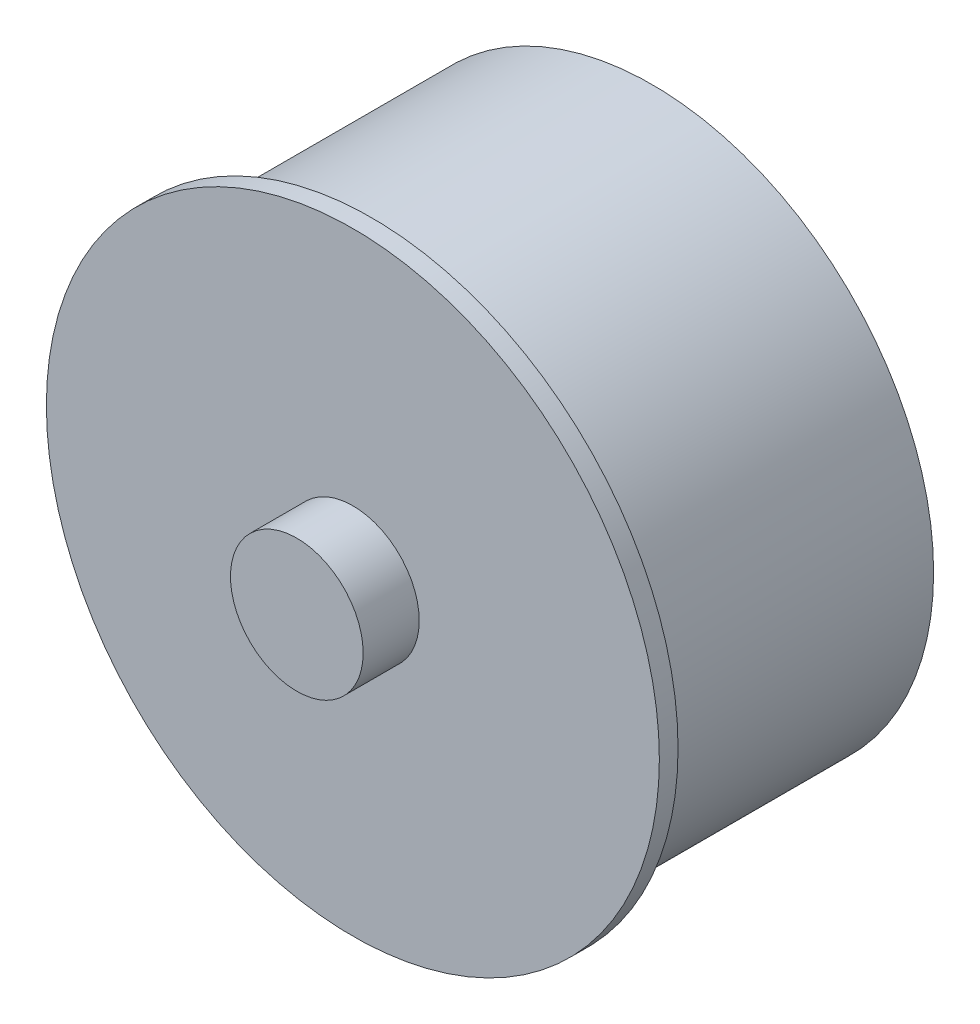
ISO-10303-21;
HEADER;
FILE_DESCRIPTION(('STEP AP214'),'2;1');
FILE_NAME('part.step','',(''),(''),'','','');
FILE_SCHEMA(('AUTOMOTIVE_DESIGN { 1 0 10303 214 1 1 1 1 }'));
ENDSEC;
DATA;
#1=APPLICATION_CONTEXT('core data for automotive mechanical design processes');
#2=APPLICATION_PROTOCOL_DEFINITION('international standard','automotive_design',2000,#1);
#3=PRODUCT_CONTEXT('',#1,'mechanical');
#4=PRODUCT('Part','Part','',(#3));
#5=PRODUCT_RELATED_PRODUCT_CATEGORY('part','',(#4));
#6=PRODUCT_DEFINITION_FORMATION('','',#4);
#7=PRODUCT_DEFINITION_CONTEXT('part definition',#1,'design');
#8=PRODUCT_DEFINITION('design','',#6,#7);
#9=PRODUCT_DEFINITION_SHAPE('','',#8);
#10=(LENGTH_UNIT() NAMED_UNIT(*) SI_UNIT(.MILLI.,.METRE.));
#11=(NAMED_UNIT(*) PLANE_ANGLE_UNIT() SI_UNIT($,.RADIAN.));
#12=(NAMED_UNIT(*) SI_UNIT($,.STERADIAN.) SOLID_ANGLE_UNIT());
#13=UNCERTAINTY_MEASURE_WITH_UNIT(LENGTH_MEASURE(1.E-05),#10,'distance_accuracy_value','');
#14=(GEOMETRIC_REPRESENTATION_CONTEXT(3) GLOBAL_UNCERTAINTY_ASSIGNED_CONTEXT((#13)) GLOBAL_UNIT_ASSIGNED_CONTEXT((#10,
#11,#12)) REPRESENTATION_CONTEXT('',''));
#15=CARTESIAN_POINT('',(0.,0.,0.));
#16=DIRECTION('',(0.,0.,1.));
#17=DIRECTION('',(1.,0.,0.));
#18=AXIS2_PLACEMENT_3D('',#15,#16,#17);
#19=CARTESIAN_POINT('',(0.,0.,-2.));
#20=DIRECTION('',(0.,0.,1.));
#21=DIRECTION('',(1.,0.,0.));
#22=AXIS2_PLACEMENT_3D('',#19,#20,#21);
#23=CYLINDRICAL_SURFACE('',#22,10.075);
#24=CARTESIAN_POINT('',(0.,0.,0.));
#25=DIRECTION('',(0.,0.,-1.));
#26=DIRECTION('',(-1.,0.,0.));
#27=AXIS2_PLACEMENT_3D('',#24,#25,#26);
#28=CIRCLE('',#27,10.075);
#29=CARTESIAN_POINT('',(-10.075,0.,0.));
#30=VERTEX_POINT('',#29);
#31=EDGE_CURVE('E11',#30,#30,#28,.T.);
#32=ORIENTED_EDGE('',*,*,#31,.T.);
#33=EDGE_LOOP('',(#32));
#34=FACE_BOUND('',#33,.T.);
#35=CARTESIAN_POINT('',(0.,0.,-1.));
#36=DIRECTION('',(0.,0.,-1.));
#37=DIRECTION('',(-1.,0.,0.));
#38=AXIS2_PLACEMENT_3D('',#35,#36,#37);
#39=CIRCLE('',#38,10.075);
#40=CARTESIAN_POINT('',(-10.075,0.,-1.));
#41=VERTEX_POINT('',#40);
#42=EDGE_CURVE('E87',#41,#41,#39,.T.);
#43=ORIENTED_EDGE('',*,*,#42,.F.);
#44=EDGE_LOOP('',(#43));
#45=FACE_BOUND('',#44,.T.);
#46=ADVANCED_FACE('F44',(#34,#45),#23,.T.);
#47=CARTESIAN_POINT('',(8.,0.,8.));
#48=DIRECTION('',(0.,0.,-1.));
#49=DIRECTION('',(-1.,0.,0.));
#50=AXIS2_PLACEMENT_3D('',#47,#48,#49);
#51=CYLINDRICAL_SURFACE('',#50,1.05);
#52=CARTESIAN_POINT('',(8.,0.,0.));
#53=DIRECTION('',(0.,0.,-1.));
#54=DIRECTION('',(-1.,0.,0.));
#55=AXIS2_PLACEMENT_3D('',#52,#53,#54);
#56=CIRCLE('',#55,1.05);
#57=CARTESIAN_POINT('',(6.95,0.,0.));
#58=VERTEX_POINT('',#57);
#59=EDGE_CURVE('E61',#58,#58,#56,.T.);
#60=ORIENTED_EDGE('',*,*,#59,.F.);
#61=EDGE_LOOP('',(#60));
#62=FACE_BOUND('',#61,.T.);
#63=CARTESIAN_POINT('',(8.,0.,-1.));
#64=DIRECTION('',(0.,0.,-1.));
#65=DIRECTION('',(-1.,0.,0.));
#66=AXIS2_PLACEMENT_3D('',#63,#64,#65);
#67=CIRCLE('',#66,1.05);
#68=CARTESIAN_POINT('',(6.95,0.,-1.));
#69=VERTEX_POINT('',#68);
#70=EDGE_CURVE('E59',#69,#69,#67,.F.);
#71=ORIENTED_EDGE('',*,*,#70,.F.);
#72=EDGE_LOOP('',(#71));
#73=FACE_BOUND('',#72,.T.);
#74=ADVANCED_FACE('F96',(#62,#73),#51,.F.);
#75=CARTESIAN_POINT('',(0.,-8.,8.));
#76=DIRECTION('',(0.,0.,-1.));
#77=DIRECTION('',(-1.,0.,0.));
#78=AXIS2_PLACEMENT_3D('',#75,#76,#77);
#79=CYLINDRICAL_SURFACE('',#78,1.05);
#80=CARTESIAN_POINT('',(0.,-8.,0.));
#81=DIRECTION('',(0.,0.,-1.));
#82=DIRECTION('',(-1.,0.,0.));
#83=AXIS2_PLACEMENT_3D('',#80,#81,#82);
#84=CIRCLE('',#83,1.05);
#85=CARTESIAN_POINT('',(-1.04999999999994,-8.,0.));
#86=VERTEX_POINT('',#85);
#87=EDGE_CURVE('E64',#86,#86,#84,.T.);
#88=ORIENTED_EDGE('',*,*,#87,.F.);
#89=EDGE_LOOP('',(#88));
#90=FACE_BOUND('',#89,.T.);
#91=CARTESIAN_POINT('',(0.,-8.,-1.));
#92=DIRECTION('',(0.,0.,-1.));
#93=DIRECTION('',(-1.,0.,0.));
#94=AXIS2_PLACEMENT_3D('',#91,#92,#93);
#95=CIRCLE('',#94,1.05);
#96=CARTESIAN_POINT('',(-1.04999999999994,-8.,-1.));
#97=VERTEX_POINT('',#96);
#98=EDGE_CURVE('E83',#97,#97,#95,.F.);
#99=ORIENTED_EDGE('',*,*,#98,.F.);
#100=EDGE_LOOP('',(#99));
#101=FACE_BOUND('',#100,.T.);
#102=ADVANCED_FACE('F77',(#90,#101),#79,.F.);
#103=CARTESIAN_POINT('',(-8.,0.,8.));
#104=DIRECTION('',(0.,0.,-1.));
#105=DIRECTION('',(-1.,0.,0.));
#106=AXIS2_PLACEMENT_3D('',#103,#104,#105);
#107=CYLINDRICAL_SURFACE('',#106,1.05);
#108=CARTESIAN_POINT('',(-8.,0.,0.));
#109=DIRECTION('',(0.,0.,-1.));
#110=DIRECTION('',(-1.,0.,0.));
#111=AXIS2_PLACEMENT_3D('',#108,#109,#110);
#112=CIRCLE('',#111,1.05);
#113=CARTESIAN_POINT('',(-9.05,0.,0.));
#114=VERTEX_POINT('',#113);
#115=EDGE_CURVE('E56',#114,#114,#112,.T.);
#116=ORIENTED_EDGE('',*,*,#115,.F.);
#117=EDGE_LOOP('',(#116));
#118=FACE_BOUND('',#117,.T.);
#119=CARTESIAN_POINT('',(-8.,0.,-1.));
#120=DIRECTION('',(0.,0.,-1.));
#121=DIRECTION('',(-1.,0.,0.));
#122=AXIS2_PLACEMENT_3D('',#119,#120,#121);
#123=CIRCLE('',#122,1.05);
#124=CARTESIAN_POINT('',(-9.05,0.,-1.));
#125=VERTEX_POINT('',#124);
#126=EDGE_CURVE('E81',#125,#125,#123,.F.);
#127=ORIENTED_EDGE('',*,*,#126,.F.);
#128=EDGE_LOOP('',(#127));
#129=FACE_BOUND('',#128,.T.);
#130=ADVANCED_FACE('F73',(#118,#129),#107,.F.);
#131=CARTESIAN_POINT('',(0.,8.,8.));
#132=DIRECTION('',(0.,0.,-1.));
#133=DIRECTION('',(-1.,0.,0.));
#134=AXIS2_PLACEMENT_3D('',#131,#132,#133);
#135=CYLINDRICAL_SURFACE('',#134,1.05);
#136=CARTESIAN_POINT('',(0.,8.,0.));
#137=DIRECTION('',(0.,0.,-1.));
#138=DIRECTION('',(-1.,0.,0.));
#139=AXIS2_PLACEMENT_3D('',#136,#137,#138);
#140=CIRCLE('',#139,1.05);
#141=CARTESIAN_POINT('',(-1.05,8.,0.));
#142=VERTEX_POINT('',#141);
#143=EDGE_CURVE('E51',#142,#142,#140,.T.);
#144=ORIENTED_EDGE('',*,*,#143,.F.);
#145=EDGE_LOOP('',(#144));
#146=FACE_BOUND('',#145,.T.);
#147=CARTESIAN_POINT('',(0.,8.,-1.));
#148=DIRECTION('',(0.,0.,-1.));
#149=DIRECTION('',(-1.,0.,0.));
#150=AXIS2_PLACEMENT_3D('',#147,#148,#149);
#151=CIRCLE('',#150,1.05);
#152=CARTESIAN_POINT('',(-1.05,8.,-1.));
#153=VERTEX_POINT('',#152);
#154=EDGE_CURVE('E47',#153,#153,#151,.F.);
#155=ORIENTED_EDGE('',*,*,#154,.F.);
#156=EDGE_LOOP('',(#155));
#157=FACE_BOUND('',#156,.T.);
#158=ADVANCED_FACE('F76',(#146,#157),#135,.F.);
#159=CARTESIAN_POINT('',(0.,0.,0.));
#160=DIRECTION('',(0.,0.,-1.));
#161=DIRECTION('',(-1.,0.,0.));
#162=AXIS2_PLACEMENT_3D('',#159,#160,#161);
#163=PLANE('',#162);
#164=ORIENTED_EDGE('',*,*,#143,.T.);
#165=EDGE_LOOP('',(#164));
#166=FACE_BOUND('',#165,.T.);
#167=ORIENTED_EDGE('',*,*,#115,.T.);
#168=EDGE_LOOP('',(#167));
#169=FACE_BOUND('',#168,.T.);
#170=ORIENTED_EDGE('',*,*,#87,.T.);
#171=EDGE_LOOP('',(#170));
#172=FACE_BOUND('',#171,.T.);
#173=ORIENTED_EDGE('',*,*,#59,.T.);
#174=EDGE_LOOP('',(#173));
#175=FACE_BOUND('',#174,.T.);
#176=ORIENTED_EDGE('',*,*,#31,.F.);
#177=EDGE_LOOP('',(#176));
#178=FACE_BOUND('',#177,.T.);
#179=ADVANCED_FACE('F70',(#166,#169,#172,#175,#178),#163,.F.);
#180=CARTESIAN_POINT('',(0.,0.,-1.));
#181=DIRECTION('',(0.,0.,-1.));
#182=DIRECTION('',(-1.,0.,0.));
#183=AXIS2_PLACEMENT_3D('',#180,#181,#182);
#184=PLANE('',#183);
#185=ORIENTED_EDGE('',*,*,#42,.T.);
#186=EDGE_LOOP('',(#185));
#187=FACE_BOUND('',#186,.T.);
#188=ORIENTED_EDGE('',*,*,#154,.T.);
#189=EDGE_LOOP('',(#188));
#190=FACE_BOUND('',#189,.T.);
#191=ORIENTED_EDGE('',*,*,#126,.T.);
#192=EDGE_LOOP('',(#191));
#193=FACE_BOUND('',#192,.T.);
#194=ORIENTED_EDGE('',*,*,#98,.T.);
#195=EDGE_LOOP('',(#194));
#196=FACE_BOUND('',#195,.T.);
#197=ORIENTED_EDGE('',*,*,#70,.T.);
#198=EDGE_LOOP('',(#197));
#199=FACE_BOUND('',#198,.T.);
#200=ADVANCED_FACE('F92',(#187,#190,#193,#196,#199),#184,.T.);
#201=CLOSED_SHELL('',(#46,#74,#102,#130,#158,#179,#200));
#202=MANIFOLD_SOLID_BREP('B2',#201);
#203=CARTESIAN_POINT('',(0.,0.,16.));
#204=DIRECTION('',(0.,0.,-1.));
#205=DIRECTION('',(-1.,0.,0.));
#206=AXIS2_PLACEMENT_3D('',#203,#204,#205);
#207=CYLINDRICAL_SURFACE('',#206,15.075);
#208=CARTESIAN_POINT('',(0.,0.,16.));
#209=DIRECTION('',(0.,0.,-1.));
#210=DIRECTION('',(-1.,0.,0.));
#211=AXIS2_PLACEMENT_3D('',#208,#209,#210);
#212=CIRCLE('',#211,15.075);
#213=CARTESIAN_POINT('',(-15.075,0.,16.));
#214=VERTEX_POINT('',#213);
#215=EDGE_CURVE('E290',#214,#214,#212,.T.);
#216=ORIENTED_EDGE('',*,*,#215,.T.);
#217=EDGE_LOOP('',(#216));
#218=FACE_BOUND('',#217,.T.);
#219=CARTESIAN_POINT('',(0.,0.,1.));
#220=DIRECTION('',(0.,0.,-1.));
#221=DIRECTION('',(-1.,0.,0.));
#222=AXIS2_PLACEMENT_3D('',#219,#220,#221);
#223=CIRCLE('',#222,15.075);
#224=CARTESIAN_POINT('',(-15.075,0.,1.));
#225=VERTEX_POINT('',#224);
#226=EDGE_CURVE('E285',#225,#225,#223,.T.);
#227=ORIENTED_EDGE('',*,*,#226,.F.);
#228=EDGE_LOOP('',(#227));
#229=FACE_BOUND('',#228,.T.);
#230=ADVANCED_FACE('F168',(#218,#229),#207,.T.);
#231=CARTESIAN_POINT('',(0.,0.,17.));
#232=DIRECTION('',(0.,0.,-1.));
#233=DIRECTION('',(-1.,0.,0.));
#234=AXIS2_PLACEMENT_3D('',#231,#232,#233);
#235=CYLINDRICAL_SURFACE('',#234,16.4);
#236=CARTESIAN_POINT('',(0.,0.,17.));
#237=DIRECTION('',(0.,0.,1.));
#238=DIRECTION('',(1.,0.,0.));
#239=AXIS2_PLACEMENT_3D('',#236,#237,#238);
#240=CIRCLE('',#239,16.4);
#241=CARTESIAN_POINT('',(16.4,0.,17.));
#242=VERTEX_POINT('',#241);
#243=EDGE_CURVE('E176',#242,#242,#240,.T.);
#244=ORIENTED_EDGE('',*,*,#243,.F.);
#245=EDGE_LOOP('',(#244));
#246=FACE_BOUND('',#245,.T.);
#247=CARTESIAN_POINT('',(0.,0.,16.));
#248=DIRECTION('',(0.,0.,-1.));
#249=DIRECTION('',(-1.,0.,0.));
#250=AXIS2_PLACEMENT_3D('',#247,#248,#249);
#251=CIRCLE('',#250,16.4);
#252=CARTESIAN_POINT('',(-16.4,0.,16.));
#253=VERTEX_POINT('',#252);
#254=EDGE_CURVE('E292',#253,#253,#251,.T.);
#255=ORIENTED_EDGE('',*,*,#254,.F.);
#256=EDGE_LOOP('',(#255));
#257=FACE_BOUND('',#256,.T.);
#258=ADVANCED_FACE('F170',(#246,#257),#235,.T.);
#259=CARTESIAN_POINT('',(0.,0.,17.));
#260=DIRECTION('',(0.,0.,1.));
#261=DIRECTION('',(1.,0.,0.));
#262=AXIS2_PLACEMENT_3D('',#259,#260,#261);
#263=PLANE('',#262);
#264=CARTESIAN_POINT('',(0.,0.,17.));
#265=DIRECTION('',(0.,0.,1.));
#266=DIRECTION('',(1.,0.,0.));
#267=AXIS2_PLACEMENT_3D('',#264,#265,#266);
#268=CIRCLE('',#267,3.55);
#269=CARTESIAN_POINT('',(3.55,0.,17.));
#270=VERTEX_POINT('',#269);
#271=EDGE_CURVE('E43',#270,#270,#268,.T.);
#272=ORIENTED_EDGE('',*,*,#271,.F.);
#273=EDGE_LOOP('',(#272));
#274=FACE_BOUND('',#273,.T.);
#275=ORIENTED_EDGE('',*,*,#243,.T.);
#276=EDGE_LOOP('',(#275));
#277=FACE_BOUND('',#276,.T.);
#278=ADVANCED_FACE('F206',(#274,#277),#263,.T.);
#279=CARTESIAN_POINT('',(0.,0.,20.));
#280=DIRECTION('',(0.,0.,-1.));
#281=DIRECTION('',(-1.,0.,0.));
#282=AXIS2_PLACEMENT_3D('',#279,#280,#281);
#283=CYLINDRICAL_SURFACE('',#282,3.55);
#284=CARTESIAN_POINT('',(0.,0.,20.));
#285=DIRECTION('',(0.,0.,1.));
#286=DIRECTION('',(1.,0.,0.));
#287=AXIS2_PLACEMENT_3D('',#284,#285,#286);
#288=CIRCLE('',#287,3.55);
#289=CARTESIAN_POINT('',(3.55,0.,20.));
#290=VERTEX_POINT('',#289);
#291=EDGE_CURVE('E181',#290,#290,#288,.T.);
#292=ORIENTED_EDGE('',*,*,#291,.F.);
#293=EDGE_LOOP('',(#292));
#294=FACE_BOUND('',#293,.T.);
#295=ORIENTED_EDGE('',*,*,#271,.T.);
#296=EDGE_LOOP('',(#295));
#297=FACE_BOUND('',#296,.T.);
#298=ADVANCED_FACE('F204',(#294,#297),#283,.T.);
#299=CARTESIAN_POINT('',(0.,0.,20.));
#300=DIRECTION('',(0.,0.,1.));
#301=DIRECTION('',(1.,0.,0.));
#302=AXIS2_PLACEMENT_3D('',#299,#300,#301);
#303=PLANE('',#302);
#304=ORIENTED_EDGE('',*,*,#291,.T.);
#305=EDGE_LOOP('',(#304));
#306=FACE_BOUND('',#305,.T.);
#307=ADVANCED_FACE('F202',(#306),#303,.T.);
#308=CARTESIAN_POINT('',(0.,0.,16.));
#309=DIRECTION('',(0.,0.,-1.));
#310=DIRECTION('',(-1.,0.,0.));
#311=AXIS2_PLACEMENT_3D('',#308,#309,#310);
#312=PLANE('',#311);
#313=ORIENTED_EDGE('',*,*,#215,.F.);
#314=EDGE_LOOP('',(#313));
#315=FACE_BOUND('',#314,.T.);
#316=ORIENTED_EDGE('',*,*,#254,.T.);
#317=EDGE_LOOP('',(#316));
#318=FACE_BOUND('',#317,.T.);
#319=ADVANCED_FACE('F212',(#315,#318),#312,.T.);
#320=CARTESIAN_POINT('',(0.,0.,1.));
#321=DIRECTION('',(0.,0.,-1.));
#322=DIRECTION('',(-1.,0.,0.));
#323=AXIS2_PLACEMENT_3D('',#320,#321,#322);
#324=PLANE('',#323);
#325=CARTESIAN_POINT('',(0.,0.,1.));
#326=DIRECTION('',(0.,0.,-1.));
#327=DIRECTION('',(-1.,0.,0.));
#328=AXIS2_PLACEMENT_3D('',#325,#326,#327);
#329=CIRCLE('',#328,10.075);
#330=CARTESIAN_POINT('',(-10.075,0.,1.));
#331=VERTEX_POINT('',#330);
#332=EDGE_CURVE('E282',#331,#331,#329,.T.);
#333=ORIENTED_EDGE('',*,*,#332,.F.);
#334=EDGE_LOOP('',(#333));
#335=FACE_BOUND('',#334,.T.);
#336=ORIENTED_EDGE('',*,*,#226,.T.);
#337=EDGE_LOOP('',(#336));
#338=FACE_BOUND('',#337,.T.);
#339=ADVANCED_FACE('F229',(#335,#338),#324,.T.);
#340=CARTESIAN_POINT('',(0.,0.,1.));
#341=DIRECTION('',(0.,0.,-1.));
#342=DIRECTION('',(-1.,0.,0.));
#343=AXIS2_PLACEMENT_3D('',#340,#341,#342);
#344=CYLINDRICAL_SURFACE('',#343,10.075);
#345=ORIENTED_EDGE('',*,*,#332,.T.);
#346=EDGE_LOOP('',(#345));
#347=FACE_BOUND('',#346,.T.);
#348=CARTESIAN_POINT('',(0.,0.,0.));
#349=DIRECTION('',(0.,0.,-1.));
#350=DIRECTION('',(-1.,0.,0.));
#351=AXIS2_PLACEMENT_3D('',#348,#349,#350);
#352=CIRCLE('',#351,10.075);
#353=CARTESIAN_POINT('',(-10.075,0.,0.));
#354=VERTEX_POINT('',#353);
#355=EDGE_CURVE('E280',#354,#354,#352,.T.);
#356=ORIENTED_EDGE('',*,*,#355,.F.);
#357=EDGE_LOOP('',(#356));
#358=FACE_BOUND('',#357,.T.);
#359=ADVANCED_FACE('F263',(#347,#358),#344,.T.);
#360=CARTESIAN_POINT('',(0.,0.,8.));
#361=DIRECTION('',(0.,0.,-1.));
#362=DIRECTION('',(-1.,0.,0.));
#363=AXIS2_PLACEMENT_3D('',#360,#361,#362);
#364=PLANE('',#363);
#365=CARTESIAN_POINT('',(8.,0.,8.));
#366=DIRECTION('',(0.,0.,-1.));
#367=DIRECTION('',(-1.,0.,0.));
#368=AXIS2_PLACEMENT_3D('',#365,#366,#367);
#369=CIRCLE('',#368,1.05);
#370=CARTESIAN_POINT('',(6.95,0.,8.));
#371=VERTEX_POINT('',#370);
#372=EDGE_CURVE('E273',#371,#371,#369,.T.);
#373=ORIENTED_EDGE('',*,*,#372,.T.);
#374=EDGE_LOOP('',(#373));
#375=FACE_BOUND('',#374,.T.);
#376=ADVANCED_FACE('F256',(#375),#364,.T.);
#377=CARTESIAN_POINT('',(0.,0.,8.));
#378=DIRECTION('',(0.,0.,-1.));
#379=DIRECTION('',(-1.,0.,0.));
#380=AXIS2_PLACEMENT_3D('',#377,#378,#379);
#381=PLANE('',#380);
#382=CARTESIAN_POINT('',(0.,-8.,8.));
#383=DIRECTION('',(0.,0.,-1.));
#384=DIRECTION('',(-1.,0.,0.));
#385=AXIS2_PLACEMENT_3D('',#382,#383,#384);
#386=CIRCLE('',#385,1.05);
#387=CARTESIAN_POINT('',(-1.04999999999994,-8.,8.));
#388=VERTEX_POINT('',#387);
#389=EDGE_CURVE('E300',#388,#388,#386,.T.);
#390=ORIENTED_EDGE('',*,*,#389,.T.);
#391=EDGE_LOOP('',(#390));
#392=FACE_BOUND('',#391,.T.);
#393=ADVANCED_FACE('F248',(#392),#381,.T.);
#394=CARTESIAN_POINT('',(0.,0.,8.));
#395=DIRECTION('',(0.,0.,-1.));
#396=DIRECTION('',(-1.,0.,0.));
#397=AXIS2_PLACEMENT_3D('',#394,#395,#396);
#398=PLANE('',#397);
#399=CARTESIAN_POINT('',(-8.,0.,8.));
#400=DIRECTION('',(0.,0.,-1.));
#401=DIRECTION('',(-1.,0.,0.));
#402=AXIS2_PLACEMENT_3D('',#399,#400,#401);
#403=CIRCLE('',#402,1.05);
#404=CARTESIAN_POINT('',(-9.05,0.,8.));
#405=VERTEX_POINT('',#404);
#406=EDGE_CURVE('E297',#405,#405,#403,.T.);
#407=ORIENTED_EDGE('',*,*,#406,.T.);
#408=EDGE_LOOP('',(#407));
#409=FACE_BOUND('',#408,.T.);
#410=ADVANCED_FACE('F238',(#409),#398,.T.);
#411=CARTESIAN_POINT('',(0.,0.,8.));
#412=DIRECTION('',(0.,0.,-1.));
#413=DIRECTION('',(-1.,0.,0.));
#414=AXIS2_PLACEMENT_3D('',#411,#412,#413);
#415=PLANE('',#414);
#416=CARTESIAN_POINT('',(0.,8.,8.));
#417=DIRECTION('',(0.,0.,-1.));
#418=DIRECTION('',(-1.,0.,0.));
#419=AXIS2_PLACEMENT_3D('',#416,#417,#418);
#420=CIRCLE('',#419,1.05);
#421=CARTESIAN_POINT('',(-1.05,8.,8.));
#422=VERTEX_POINT('',#421);
#423=EDGE_CURVE('E190',#422,#422,#420,.T.);
#424=ORIENTED_EDGE('',*,*,#423,.T.);
#425=EDGE_LOOP('',(#424));
#426=FACE_BOUND('',#425,.T.);
#427=ADVANCED_FACE('F234',(#426),#415,.T.);
#428=CARTESIAN_POINT('',(8.,0.,8.));
#429=DIRECTION('',(0.,0.,-1.));
#430=DIRECTION('',(-1.,0.,0.));
#431=AXIS2_PLACEMENT_3D('',#428,#429,#430);
#432=CYLINDRICAL_SURFACE('',#431,1.05);
#433=ORIENTED_EDGE('',*,*,#372,.F.);
#434=EDGE_LOOP('',(#433));
#435=FACE_BOUND('',#434,.T.);
#436=CARTESIAN_POINT('',(8.,0.,0.));
#437=DIRECTION('',(0.,0.,1.));
#438=DIRECTION('',(1.,0.,0.));
#439=AXIS2_PLACEMENT_3D('',#436,#437,#438);
#440=CIRCLE('',#439,1.05);
#441=CARTESIAN_POINT('',(9.05,0.,0.));
#442=VERTEX_POINT('',#441);
#443=EDGE_CURVE('E186',#442,#442,#440,.T.);
#444=ORIENTED_EDGE('',*,*,#443,.F.);
#445=EDGE_LOOP('',(#444));
#446=FACE_BOUND('',#445,.T.);
#447=ADVANCED_FACE('F237',(#435,#446),#432,.F.);
#448=CARTESIAN_POINT('',(0.,-8.,8.));
#449=DIRECTION('',(0.,0.,-1.));
#450=DIRECTION('',(-1.,0.,0.));
#451=AXIS2_PLACEMENT_3D('',#448,#449,#450);
#452=CYLINDRICAL_SURFACE('',#451,1.05);
#453=ORIENTED_EDGE('',*,*,#389,.F.);
#454=EDGE_LOOP('',(#453));
#455=FACE_BOUND('',#454,.T.);
#456=CARTESIAN_POINT('',(0.,-8.,0.));
#457=DIRECTION('',(0.,0.,1.));
#458=DIRECTION('',(1.,0.,0.));
#459=AXIS2_PLACEMENT_3D('',#456,#457,#458);
#460=CIRCLE('',#459,1.05);
#461=CARTESIAN_POINT('',(1.05000000000006,-8.,0.));
#462=VERTEX_POINT('',#461);
#463=EDGE_CURVE('E189',#462,#462,#460,.T.);
#464=ORIENTED_EDGE('',*,*,#463,.F.);
#465=EDGE_LOOP('',(#464));
#466=FACE_BOUND('',#465,.T.);
#467=ADVANCED_FACE('F252',(#455,#466),#452,.F.);
#468=CARTESIAN_POINT('',(-8.,0.,8.));
#469=DIRECTION('',(0.,0.,-1.));
#470=DIRECTION('',(-1.,0.,0.));
#471=AXIS2_PLACEMENT_3D('',#468,#469,#470);
#472=CYLINDRICAL_SURFACE('',#471,1.05);
#473=ORIENTED_EDGE('',*,*,#406,.F.);
#474=EDGE_LOOP('',(#473));
#475=FACE_BOUND('',#474,.T.);
#476=CARTESIAN_POINT('',(-8.,0.,0.));
#477=DIRECTION('',(0.,0.,1.));
#478=DIRECTION('',(1.,0.,0.));
#479=AXIS2_PLACEMENT_3D('',#476,#477,#478);
#480=CIRCLE('',#479,1.05);
#481=CARTESIAN_POINT('',(-6.95,0.,0.));
#482=VERTEX_POINT('',#481);
#483=EDGE_CURVE('E192',#482,#482,#480,.T.);
#484=ORIENTED_EDGE('',*,*,#483,.F.);
#485=EDGE_LOOP('',(#484));
#486=FACE_BOUND('',#485,.T.);
#487=ADVANCED_FACE('F244',(#475,#486),#472,.F.);
#488=CARTESIAN_POINT('',(0.,8.,8.));
#489=DIRECTION('',(0.,0.,-1.));
#490=DIRECTION('',(-1.,0.,0.));
#491=AXIS2_PLACEMENT_3D('',#488,#489,#490);
#492=CYLINDRICAL_SURFACE('',#491,1.05);
#493=ORIENTED_EDGE('',*,*,#423,.F.);
#494=EDGE_LOOP('',(#493));
#495=FACE_BOUND('',#494,.T.);
#496=CARTESIAN_POINT('',(0.,8.,0.));
#497=DIRECTION('',(0.,0.,1.));
#498=DIRECTION('',(1.,0.,0.));
#499=AXIS2_PLACEMENT_3D('',#496,#497,#498);
#500=CIRCLE('',#499,1.05);
#501=CARTESIAN_POINT('',(1.05,8.,0.));
#502=VERTEX_POINT('',#501);
#503=EDGE_CURVE('E172',#502,#502,#500,.T.);
#504=ORIENTED_EDGE('',*,*,#503,.F.);
#505=EDGE_LOOP('',(#504));
#506=FACE_BOUND('',#505,.T.);
#507=ADVANCED_FACE('F240',(#495,#506),#492,.F.);
#508=CARTESIAN_POINT('',(0.,0.,0.));
#509=DIRECTION('',(0.,0.,1.));
#510=DIRECTION('',(1.,0.,0.));
#511=AXIS2_PLACEMENT_3D('',#508,#509,#510);
#512=PLANE('',#511);
#513=ORIENTED_EDGE('',*,*,#503,.T.);
#514=EDGE_LOOP('',(#513));
#515=FACE_BOUND('',#514,.T.);
#516=ORIENTED_EDGE('',*,*,#483,.T.);
#517=EDGE_LOOP('',(#516));
#518=FACE_BOUND('',#517,.T.);
#519=ORIENTED_EDGE('',*,*,#463,.T.);
#520=EDGE_LOOP('',(#519));
#521=FACE_BOUND('',#520,.T.);
#522=ORIENTED_EDGE('',*,*,#443,.T.);
#523=EDGE_LOOP('',(#522));
#524=FACE_BOUND('',#523,.T.);
#525=ORIENTED_EDGE('',*,*,#355,.T.);
#526=EDGE_LOOP('',(#525));
#527=FACE_BOUND('',#526,.T.);
#528=ADVANCED_FACE('F243',(#515,#518,#521,#524,#527),#512,.F.);
#529=CLOSED_SHELL('',(#230,#258,#278,#298,#307,#319,#339,#359,#376,#393,#410,#427,#447,#467,
#487,#507,#528));
#530=MANIFOLD_SOLID_BREP('B6',#529);
#531=ADVANCED_BREP_SHAPE_REPRESENTATION('',(#18,#202,#530),#14);
#532=SHAPE_DEFINITION_REPRESENTATION(#9,#531);
ENDSEC;
END-ISO-10303-21;
